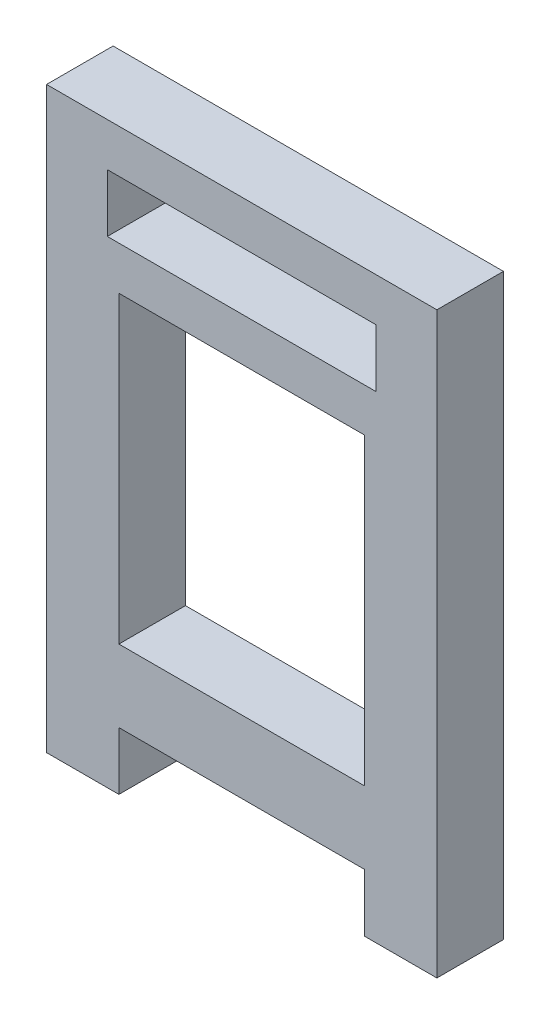
ISO-10303-21;
HEADER;
FILE_DESCRIPTION(('STEP AP214'),'2;1');
FILE_NAME('part.step','',(''),(''),'','','');
FILE_SCHEMA(('AUTOMOTIVE_DESIGN { 1 0 10303 214 1 1 1 1 }'));
ENDSEC;
DATA;
#1=APPLICATION_CONTEXT('core data for automotive mechanical design processes');
#2=APPLICATION_PROTOCOL_DEFINITION('international standard','automotive_design',2000,#1);
#3=PRODUCT_CONTEXT('',#1,'mechanical');
#4=PRODUCT('Part','Part','',(#3));
#5=PRODUCT_RELATED_PRODUCT_CATEGORY('part','',(#4));
#6=PRODUCT_DEFINITION_FORMATION('','',#4);
#7=PRODUCT_DEFINITION_CONTEXT('part definition',#1,'design');
#8=PRODUCT_DEFINITION('design','',#6,#7);
#9=PRODUCT_DEFINITION_SHAPE('','',#8);
#10=(LENGTH_UNIT() NAMED_UNIT(*) SI_UNIT(.MILLI.,.METRE.));
#11=(NAMED_UNIT(*) PLANE_ANGLE_UNIT() SI_UNIT($,.RADIAN.));
#12=(NAMED_UNIT(*) SI_UNIT($,.STERADIAN.) SOLID_ANGLE_UNIT());
#13=UNCERTAINTY_MEASURE_WITH_UNIT(LENGTH_MEASURE(1.E-05),#10,'distance_accuracy_value','');
#14=(GEOMETRIC_REPRESENTATION_CONTEXT(3) GLOBAL_UNCERTAINTY_ASSIGNED_CONTEXT((#13)) GLOBAL_UNIT_ASSIGNED_CONTEXT((#10,
#11,#12)) REPRESENTATION_CONTEXT('',''));
#15=CARTESIAN_POINT('',(0.,0.,0.));
#16=DIRECTION('',(0.,0.,1.));
#17=DIRECTION('',(1.,0.,0.));
#18=AXIS2_PLACEMENT_3D('',#15,#16,#17);
#19=CARTESIAN_POINT('',(0.,0.,2.3));
#20=DIRECTION('',(0.,0.,-1.));
#21=DIRECTION('',(-1.,0.,0.));
#22=AXIS2_PLACEMENT_3D('',#19,#20,#21);
#23=PLANE('',#22);
#24=DIRECTION('',(0.,1.,0.));
#25=VECTOR('',#24,1.);
#26=CARTESIAN_POINT('',(10.99,2.5,2.3));
#27=LINE('',#26,#25);
#28=CARTESIAN_POINT('',(10.99,2.5,2.3));
#29=VERTEX_POINT('',#28);
#30=CARTESIAN_POINT('',(10.99,13.,2.3));
#31=VERTEX_POINT('',#30);
#32=EDGE_CURVE('E188',#29,#31,#27,.T.);
#33=ORIENTED_EDGE('',*,*,#32,.F.);
#34=DIRECTION('',(1.,0.,0.));
#35=VECTOR('',#34,1.);
#36=CARTESIAN_POINT('',(2.5,2.5,2.3));
#37=LINE('',#36,#35);
#38=CARTESIAN_POINT('',(2.5,2.5,2.3));
#39=VERTEX_POINT('',#38);
#40=EDGE_CURVE('E196',#39,#29,#37,.T.);
#41=ORIENTED_EDGE('',*,*,#40,.F.);
#42=DIRECTION('',(0.,-1.,0.));
#43=VECTOR('',#42,1.);
#44=CARTESIAN_POINT('',(2.5,2.5,2.3));
#45=LINE('',#44,#43);
#46=CARTESIAN_POINT('',(2.5,13.,2.3));
#47=VERTEX_POINT('',#46);
#48=EDGE_CURVE('E193',#47,#39,#45,.T.);
#49=ORIENTED_EDGE('',*,*,#48,.F.);
#50=DIRECTION('',(-1.,0.,0.));
#51=VECTOR('',#50,1.);
#52=CARTESIAN_POINT('',(2.5,13.,2.3));
#53=LINE('',#52,#51);
#54=EDGE_CURVE('E190',#31,#47,#53,.T.);
#55=ORIENTED_EDGE('',*,*,#54,.F.);
#56=EDGE_LOOP('',(#33,#41,#49,#55));
#57=FACE_BOUND('',#56,.T.);
#58=DIRECTION('',(0.,-1.,0.));
#59=VECTOR('',#58,1.);
#60=CARTESIAN_POINT('',(0.,0.,2.3));
#61=LINE('',#60,#59);
#62=CARTESIAN_POINT('',(0.,18.,2.3));
#63=VERTEX_POINT('',#62);
#64=CARTESIAN_POINT('',(0.,-2.,2.3));
#65=VERTEX_POINT('',#64);
#66=EDGE_CURVE('E219',#63,#65,#61,.T.);
#67=ORIENTED_EDGE('',*,*,#66,.T.);
#68=DIRECTION('',(1.,0.,0.));
#69=VECTOR('',#68,1.);
#70=CARTESIAN_POINT('',(0.,-2.,2.3));
#71=LINE('',#70,#69);
#72=CARTESIAN_POINT('',(2.5,-2.,2.3));
#73=VERTEX_POINT('',#72);
#74=EDGE_CURVE('E221',#65,#73,#71,.T.);
#75=ORIENTED_EDGE('',*,*,#74,.T.);
#76=DIRECTION('',(0.,1.,0.));
#77=VECTOR('',#76,1.);
#78=CARTESIAN_POINT('',(2.5,-2.,2.3));
#79=LINE('',#78,#77);
#80=CARTESIAN_POINT('',(2.5,0.,2.3));
#81=VERTEX_POINT('',#80);
#82=EDGE_CURVE('E224',#73,#81,#79,.T.);
#83=ORIENTED_EDGE('',*,*,#82,.T.);
#84=DIRECTION('',(1.,0.,0.));
#85=VECTOR('',#84,1.);
#86=CARTESIAN_POINT('',(2.5,0.,2.3));
#87=LINE('',#86,#85);
#88=CARTESIAN_POINT('',(10.99,0.,2.3));
#89=VERTEX_POINT('',#88);
#90=EDGE_CURVE('E226',#81,#89,#87,.T.);
#91=ORIENTED_EDGE('',*,*,#90,.T.);
#92=DIRECTION('',(0.,-1.,0.));
#93=VECTOR('',#92,1.);
#94=CARTESIAN_POINT('',(10.99,-2.,2.3));
#95=LINE('',#94,#93);
#96=CARTESIAN_POINT('',(10.99,-2.,2.3));
#97=VERTEX_POINT('',#96);
#98=EDGE_CURVE('E228',#89,#97,#95,.T.);
#99=ORIENTED_EDGE('',*,*,#98,.T.);
#100=DIRECTION('',(1.,0.,0.));
#101=VECTOR('',#100,1.);
#102=CARTESIAN_POINT('',(13.49,-2.,2.3));
#103=LINE('',#102,#101);
#104=CARTESIAN_POINT('',(13.49,-2.,2.3));
#105=VERTEX_POINT('',#104);
#106=EDGE_CURVE('E230',#97,#105,#103,.T.);
#107=ORIENTED_EDGE('',*,*,#106,.T.);
#108=DIRECTION('',(0.,1.,0.));
#109=VECTOR('',#108,1.);
#110=CARTESIAN_POINT('',(13.49,0.,2.3));
#111=LINE('',#110,#109);
#112=CARTESIAN_POINT('',(13.49,18.,2.3));
#113=VERTEX_POINT('',#112);
#114=EDGE_CURVE('E232',#105,#113,#111,.T.);
#115=ORIENTED_EDGE('',*,*,#114,.T.);
#116=DIRECTION('',(-1.,0.,0.));
#117=VECTOR('',#116,1.);
#118=CARTESIAN_POINT('',(0.,18.,2.3));
#119=LINE('',#118,#117);
#120=EDGE_CURVE('E234',#113,#63,#119,.T.);
#121=ORIENTED_EDGE('',*,*,#120,.T.);
#122=EDGE_LOOP('',(#67,#75,#83,#91,#99,#107,#115,#121));
#123=FACE_BOUND('',#122,.T.);
#124=DIRECTION('',(0.,-1.,0.));
#125=VECTOR('',#124,1.);
#126=CARTESIAN_POINT('',(2.1,14.5,2.3));
#127=LINE('',#126,#125);
#128=CARTESIAN_POINT('',(2.1,16.5,2.3));
#129=VERTEX_POINT('',#128);
#130=CARTESIAN_POINT('',(2.1,14.5,2.3));
#131=VERTEX_POINT('',#130);
#132=EDGE_CURVE('E152',#129,#131,#127,.T.);
#133=ORIENTED_EDGE('',*,*,#132,.F.);
#134=DIRECTION('',(-1.,0.,0.));
#135=VECTOR('',#134,1.);
#136=CARTESIAN_POINT('',(2.1,16.5,2.3));
#137=LINE('',#136,#135);
#138=CARTESIAN_POINT('',(11.39,16.5,2.3));
#139=VERTEX_POINT('',#138);
#140=EDGE_CURVE('E174',#139,#129,#137,.T.);
#141=ORIENTED_EDGE('',*,*,#140,.F.);
#142=DIRECTION('',(0.,1.,0.));
#143=VECTOR('',#142,1.);
#144=CARTESIAN_POINT('',(11.39,14.5,2.3));
#145=LINE('',#144,#143);
#146=CARTESIAN_POINT('',(11.39,14.5,2.3));
#147=VERTEX_POINT('',#146);
#148=EDGE_CURVE('E172',#147,#139,#145,.T.);
#149=ORIENTED_EDGE('',*,*,#148,.F.);
#150=DIRECTION('',(1.,0.,0.));
#151=VECTOR('',#150,1.);
#152=CARTESIAN_POINT('',(2.1,14.5,2.3));
#153=LINE('',#152,#151);
#154=EDGE_CURVE('E160',#131,#147,#153,.T.);
#155=ORIENTED_EDGE('',*,*,#154,.F.);
#156=EDGE_LOOP('',(#133,#141,#149,#155));
#157=FACE_BOUND('',#156,.T.);
#158=ADVANCED_FACE('F39',(#57,#123,#157),#23,.F.);
#159=CARTESIAN_POINT('',(0.,0.,0.));
#160=DIRECTION('',(0.,0.,-1.));
#161=DIRECTION('',(-1.,0.,0.));
#162=AXIS2_PLACEMENT_3D('',#159,#160,#161);
#163=PLANE('',#162);
#164=DIRECTION('',(0.,-1.,0.));
#165=VECTOR('',#164,1.);
#166=CARTESIAN_POINT('',(0.,0.,0.));
#167=LINE('',#166,#165);
#168=CARTESIAN_POINT('',(0.,18.,0.));
#169=VERTEX_POINT('',#168);
#170=CARTESIAN_POINT('',(0.,-2.,0.));
#171=VERTEX_POINT('',#170);
#172=EDGE_CURVE('E218',#169,#171,#167,.T.);
#173=ORIENTED_EDGE('',*,*,#172,.F.);
#174=DIRECTION('',(-1.,0.,0.));
#175=VECTOR('',#174,1.);
#176=CARTESIAN_POINT('',(0.,18.,0.));
#177=LINE('',#176,#175);
#178=CARTESIAN_POINT('',(13.49,18.,0.));
#179=VERTEX_POINT('',#178);
#180=EDGE_CURVE('E222',#179,#169,#177,.T.);
#181=ORIENTED_EDGE('',*,*,#180,.F.);
#182=DIRECTION('',(0.,1.,0.));
#183=VECTOR('',#182,1.);
#184=CARTESIAN_POINT('',(13.49,0.,0.));
#185=LINE('',#184,#183);
#186=CARTESIAN_POINT('',(13.49,-2.,0.));
#187=VERTEX_POINT('',#186);
#188=EDGE_CURVE('E249',#187,#179,#185,.T.);
#189=ORIENTED_EDGE('',*,*,#188,.F.);
#190=DIRECTION('',(1.,0.,0.));
#191=VECTOR('',#190,1.);
#192=CARTESIAN_POINT('',(13.49,-2.,0.));
#193=LINE('',#192,#191);
#194=CARTESIAN_POINT('',(10.99,-2.,0.));
#195=VERTEX_POINT('',#194);
#196=EDGE_CURVE('E246',#195,#187,#193,.T.);
#197=ORIENTED_EDGE('',*,*,#196,.F.);
#198=DIRECTION('',(0.,-1.,0.));
#199=VECTOR('',#198,1.);
#200=CARTESIAN_POINT('',(10.99,-2.,0.));
#201=LINE('',#200,#199);
#202=CARTESIAN_POINT('',(10.99,0.,0.));
#203=VERTEX_POINT('',#202);
#204=EDGE_CURVE('E244',#203,#195,#201,.T.);
#205=ORIENTED_EDGE('',*,*,#204,.F.);
#206=DIRECTION('',(1.,0.,0.));
#207=VECTOR('',#206,1.);
#208=CARTESIAN_POINT('',(2.5,0.,0.));
#209=LINE('',#208,#207);
#210=CARTESIAN_POINT('',(2.5,0.,0.));
#211=VERTEX_POINT('',#210);
#212=EDGE_CURVE('E242',#211,#203,#209,.T.);
#213=ORIENTED_EDGE('',*,*,#212,.F.);
#214=DIRECTION('',(0.,1.,0.));
#215=VECTOR('',#214,1.);
#216=CARTESIAN_POINT('',(2.5,-2.,0.));
#217=LINE('',#216,#215);
#218=CARTESIAN_POINT('',(2.5,-2.,0.));
#219=VERTEX_POINT('',#218);
#220=EDGE_CURVE('E240',#219,#211,#217,.T.);
#221=ORIENTED_EDGE('',*,*,#220,.F.);
#222=DIRECTION('',(1.,0.,0.));
#223=VECTOR('',#222,1.);
#224=CARTESIAN_POINT('',(0.,-2.,0.));
#225=LINE('',#224,#223);
#226=EDGE_CURVE('E238',#171,#219,#225,.T.);
#227=ORIENTED_EDGE('',*,*,#226,.F.);
#228=EDGE_LOOP('',(#173,#181,#189,#197,#205,#213,#221,#227));
#229=FACE_BOUND('',#228,.T.);
#230=DIRECTION('',(1.,0.,0.));
#231=VECTOR('',#230,1.);
#232=CARTESIAN_POINT('',(2.5,2.5,0.));
#233=LINE('',#232,#231);
#234=CARTESIAN_POINT('',(2.5,2.5,0.));
#235=VERTEX_POINT('',#234);
#236=CARTESIAN_POINT('',(10.99,2.5,0.));
#237=VERTEX_POINT('',#236);
#238=EDGE_CURVE('E191',#235,#237,#233,.T.);
#239=ORIENTED_EDGE('',*,*,#238,.T.);
#240=DIRECTION('',(0.,1.,0.));
#241=VECTOR('',#240,1.);
#242=CARTESIAN_POINT('',(10.99,2.5,0.));
#243=LINE('',#242,#241);
#244=CARTESIAN_POINT('',(10.99,13.,0.));
#245=VERTEX_POINT('',#244);
#246=EDGE_CURVE('E168',#237,#245,#243,.T.);
#247=ORIENTED_EDGE('',*,*,#246,.T.);
#248=DIRECTION('',(-1.,0.,0.));
#249=VECTOR('',#248,1.);
#250=CARTESIAN_POINT('',(2.5,13.,0.));
#251=LINE('',#250,#249);
#252=CARTESIAN_POINT('',(2.5,13.,0.));
#253=VERTEX_POINT('',#252);
#254=EDGE_CURVE('E201',#245,#253,#251,.T.);
#255=ORIENTED_EDGE('',*,*,#254,.T.);
#256=DIRECTION('',(0.,-1.,0.));
#257=VECTOR('',#256,1.);
#258=CARTESIAN_POINT('',(2.5,2.5,0.));
#259=LINE('',#258,#257);
#260=EDGE_CURVE('E204',#253,#235,#259,.T.);
#261=ORIENTED_EDGE('',*,*,#260,.T.);
#262=EDGE_LOOP('',(#239,#247,#255,#261));
#263=FACE_BOUND('',#262,.T.);
#264=DIRECTION('',(-1.,0.,0.));
#265=VECTOR('',#264,1.);
#266=CARTESIAN_POINT('',(2.1,16.5,0.));
#267=LINE('',#266,#265);
#268=CARTESIAN_POINT('',(11.39,16.5,0.));
#269=VERTEX_POINT('',#268);
#270=CARTESIAN_POINT('',(2.1,16.5,0.));
#271=VERTEX_POINT('',#270);
#272=EDGE_CURVE('E161',#269,#271,#267,.T.);
#273=ORIENTED_EDGE('',*,*,#272,.T.);
#274=DIRECTION('',(0.,-1.,0.));
#275=VECTOR('',#274,1.);
#276=CARTESIAN_POINT('',(2.1,14.5,0.));
#277=LINE('',#276,#275);
#278=CARTESIAN_POINT('',(2.1,14.5,0.));
#279=VERTEX_POINT('',#278);
#280=EDGE_CURVE('E62',#271,#279,#277,.T.);
#281=ORIENTED_EDGE('',*,*,#280,.T.);
#282=DIRECTION('',(1.,0.,0.));
#283=VECTOR('',#282,1.);
#284=CARTESIAN_POINT('',(2.1,14.5,0.));
#285=LINE('',#284,#283);
#286=CARTESIAN_POINT('',(11.39,14.5,0.));
#287=VERTEX_POINT('',#286);
#288=EDGE_CURVE('E167',#279,#287,#285,.T.);
#289=ORIENTED_EDGE('',*,*,#288,.T.);
#290=DIRECTION('',(0.,1.,0.));
#291=VECTOR('',#290,1.);
#292=CARTESIAN_POINT('',(11.39,14.5,0.));
#293=LINE('',#292,#291);
#294=EDGE_CURVE('E180',#287,#269,#293,.T.);
#295=ORIENTED_EDGE('',*,*,#294,.T.);
#296=EDGE_LOOP('',(#273,#281,#289,#295));
#297=FACE_BOUND('',#296,.T.);
#298=ADVANCED_FACE('F281',(#229,#263,#297),#163,.T.);
#299=CARTESIAN_POINT('',(0.,0.,2.3));
#300=DIRECTION('',(1.,0.,0.));
#301=DIRECTION('',(0.,1.,0.));
#302=AXIS2_PLACEMENT_3D('',#299,#300,#301);
#303=PLANE('',#302);
#304=ORIENTED_EDGE('',*,*,#172,.T.);
#305=DIRECTION('',(0.,0.,-1.));
#306=VECTOR('',#305,1.);
#307=CARTESIAN_POINT('',(0.,-2.,2.3));
#308=LINE('',#307,#306);
#309=EDGE_CURVE('E11',#65,#171,#308,.T.);
#310=ORIENTED_EDGE('',*,*,#309,.F.);
#311=ORIENTED_EDGE('',*,*,#66,.F.);
#312=DIRECTION('',(0.,0.,-1.));
#313=VECTOR('',#312,1.);
#314=CARTESIAN_POINT('',(0.,18.,2.3));
#315=LINE('',#314,#313);
#316=EDGE_CURVE('E236',#63,#169,#315,.T.);
#317=ORIENTED_EDGE('',*,*,#316,.T.);
#318=EDGE_LOOP('',(#304,#310,#311,#317));
#319=FACE_BOUND('',#318,.T.);
#320=ADVANCED_FACE('F41',(#319),#303,.F.);
#321=CARTESIAN_POINT('',(0.,-2.,2.3));
#322=DIRECTION('',(0.,1.,0.));
#323=DIRECTION('',(0.,0.,1.));
#324=AXIS2_PLACEMENT_3D('',#321,#322,#323);
#325=PLANE('',#324);
#326=ORIENTED_EDGE('',*,*,#226,.T.);
#327=DIRECTION('',(0.,0.,-1.));
#328=VECTOR('',#327,1.);
#329=CARTESIAN_POINT('',(2.5,-2.,2.3));
#330=LINE('',#329,#328);
#331=EDGE_CURVE('E47',#73,#219,#330,.T.);
#332=ORIENTED_EDGE('',*,*,#331,.F.);
#333=ORIENTED_EDGE('',*,*,#74,.F.);
#334=ORIENTED_EDGE('',*,*,#309,.T.);
#335=EDGE_LOOP('',(#326,#332,#333,#334));
#336=FACE_BOUND('',#335,.T.);
#337=ADVANCED_FACE('F298',(#336),#325,.F.);
#338=CARTESIAN_POINT('',(2.5,-2.,2.3));
#339=DIRECTION('',(-1.,0.,0.));
#340=DIRECTION('',(0.,0.,1.));
#341=AXIS2_PLACEMENT_3D('',#338,#339,#340);
#342=PLANE('',#341);
#343=ORIENTED_EDGE('',*,*,#220,.T.);
#344=DIRECTION('',(0.,0.,-1.));
#345=VECTOR('',#344,1.);
#346=CARTESIAN_POINT('',(2.5,0.,2.3));
#347=LINE('',#346,#345);
#348=EDGE_CURVE('E267',#81,#211,#347,.T.);
#349=ORIENTED_EDGE('',*,*,#348,.F.);
#350=ORIENTED_EDGE('',*,*,#82,.F.);
#351=ORIENTED_EDGE('',*,*,#331,.T.);
#352=EDGE_LOOP('',(#343,#349,#350,#351));
#353=FACE_BOUND('',#352,.T.);
#354=ADVANCED_FACE('F274',(#353),#342,.F.);
#355=CARTESIAN_POINT('',(2.5,0.,2.3));
#356=DIRECTION('',(0.,1.,0.));
#357=DIRECTION('',(0.,0.,1.));
#358=AXIS2_PLACEMENT_3D('',#355,#356,#357);
#359=PLANE('',#358);
#360=ORIENTED_EDGE('',*,*,#212,.T.);
#361=DIRECTION('',(0.,0.,-1.));
#362=VECTOR('',#361,1.);
#363=CARTESIAN_POINT('',(10.99,0.,2.3));
#364=LINE('',#363,#362);
#365=EDGE_CURVE('E264',#89,#203,#364,.T.);
#366=ORIENTED_EDGE('',*,*,#365,.F.);
#367=ORIENTED_EDGE('',*,*,#90,.F.);
#368=ORIENTED_EDGE('',*,*,#348,.T.);
#369=EDGE_LOOP('',(#360,#366,#367,#368));
#370=FACE_BOUND('',#369,.T.);
#371=ADVANCED_FACE('F287',(#370),#359,.F.);
#372=CARTESIAN_POINT('',(10.99,-2.,2.3));
#373=DIRECTION('',(1.,0.,0.));
#374=DIRECTION('',(0.,0.,-1.));
#375=AXIS2_PLACEMENT_3D('',#372,#373,#374);
#376=PLANE('',#375);
#377=ORIENTED_EDGE('',*,*,#204,.T.);
#378=DIRECTION('',(0.,0.,-1.));
#379=VECTOR('',#378,1.);
#380=CARTESIAN_POINT('',(10.99,-2.,2.3));
#381=LINE('',#380,#379);
#382=EDGE_CURVE('E261',#97,#195,#381,.T.);
#383=ORIENTED_EDGE('',*,*,#382,.F.);
#384=ORIENTED_EDGE('',*,*,#98,.F.);
#385=ORIENTED_EDGE('',*,*,#365,.T.);
#386=EDGE_LOOP('',(#377,#383,#384,#385));
#387=FACE_BOUND('',#386,.T.);
#388=ADVANCED_FACE('F291',(#387),#376,.F.);
#389=CARTESIAN_POINT('',(13.49,-2.,2.3));
#390=DIRECTION('',(0.,1.,0.));
#391=DIRECTION('',(-1.,0.,0.));
#392=AXIS2_PLACEMENT_3D('',#389,#390,#391);
#393=PLANE('',#392);
#394=ORIENTED_EDGE('',*,*,#196,.T.);
#395=DIRECTION('',(0.,0.,-1.));
#396=VECTOR('',#395,1.);
#397=CARTESIAN_POINT('',(13.49,-2.,2.3));
#398=LINE('',#397,#396);
#399=EDGE_CURVE('E258',#105,#187,#398,.T.);
#400=ORIENTED_EDGE('',*,*,#399,.F.);
#401=ORIENTED_EDGE('',*,*,#106,.F.);
#402=ORIENTED_EDGE('',*,*,#382,.T.);
#403=EDGE_LOOP('',(#394,#400,#401,#402));
#404=FACE_BOUND('',#403,.T.);
#405=ADVANCED_FACE('F310',(#404),#393,.F.);
#406=CARTESIAN_POINT('',(13.49,0.,2.3));
#407=DIRECTION('',(-1.,0.,0.));
#408=DIRECTION('',(0.,0.,1.));
#409=AXIS2_PLACEMENT_3D('',#406,#407,#408);
#410=PLANE('',#409);
#411=ORIENTED_EDGE('',*,*,#188,.T.);
#412=DIRECTION('',(0.,0.,-1.));
#413=VECTOR('',#412,1.);
#414=CARTESIAN_POINT('',(13.49,18.,2.3));
#415=LINE('',#414,#413);
#416=EDGE_CURVE('E255',#113,#179,#415,.T.);
#417=ORIENTED_EDGE('',*,*,#416,.F.);
#418=ORIENTED_EDGE('',*,*,#114,.F.);
#419=ORIENTED_EDGE('',*,*,#399,.T.);
#420=EDGE_LOOP('',(#411,#417,#418,#419));
#421=FACE_BOUND('',#420,.T.);
#422=ADVANCED_FACE('F308',(#421),#410,.F.);
#423=CARTESIAN_POINT('',(0.,18.,2.3));
#424=DIRECTION('',(0.,-1.,0.));
#425=DIRECTION('',(0.,0.,-1.));
#426=AXIS2_PLACEMENT_3D('',#423,#424,#425);
#427=PLANE('',#426);
#428=ORIENTED_EDGE('',*,*,#180,.T.);
#429=ORIENTED_EDGE('',*,*,#316,.F.);
#430=ORIENTED_EDGE('',*,*,#120,.F.);
#431=ORIENTED_EDGE('',*,*,#416,.T.);
#432=EDGE_LOOP('',(#428,#429,#430,#431));
#433=FACE_BOUND('',#432,.T.);
#434=ADVANCED_FACE('F303',(#433),#427,.F.);
#435=CARTESIAN_POINT('',(10.99,2.5,2.3));
#436=DIRECTION('',(-1.,0.,0.));
#437=DIRECTION('',(0.,0.,1.));
#438=AXIS2_PLACEMENT_3D('',#435,#436,#437);
#439=PLANE('',#438);
#440=ORIENTED_EDGE('',*,*,#246,.F.);
#441=DIRECTION('',(0.,0.,-1.));
#442=VECTOR('',#441,1.);
#443=CARTESIAN_POINT('',(10.99,2.5,2.3));
#444=LINE('',#443,#442);
#445=EDGE_CURVE('E198',#29,#237,#444,.T.);
#446=ORIENTED_EDGE('',*,*,#445,.F.);
#447=ORIENTED_EDGE('',*,*,#32,.T.);
#448=DIRECTION('',(0.,0.,-1.));
#449=VECTOR('',#448,1.);
#450=CARTESIAN_POINT('',(10.99,13.,2.3));
#451=LINE('',#450,#449);
#452=EDGE_CURVE('E215',#31,#245,#451,.T.);
#453=ORIENTED_EDGE('',*,*,#452,.T.);
#454=EDGE_LOOP('',(#440,#446,#447,#453));
#455=FACE_BOUND('',#454,.T.);
#456=ADVANCED_FACE('F328',(#455),#439,.T.);
#457=CARTESIAN_POINT('',(2.5,13.,2.3));
#458=DIRECTION('',(0.,-1.,0.));
#459=DIRECTION('',(0.,0.,-1.));
#460=AXIS2_PLACEMENT_3D('',#457,#458,#459);
#461=PLANE('',#460);
#462=ORIENTED_EDGE('',*,*,#254,.F.);
#463=ORIENTED_EDGE('',*,*,#452,.F.);
#464=ORIENTED_EDGE('',*,*,#54,.T.);
#465=DIRECTION('',(0.,0.,-1.));
#466=VECTOR('',#465,1.);
#467=CARTESIAN_POINT('',(2.5,13.,2.3));
#468=LINE('',#467,#466);
#469=EDGE_CURVE('E213',#47,#253,#468,.T.);
#470=ORIENTED_EDGE('',*,*,#469,.T.);
#471=EDGE_LOOP('',(#462,#463,#464,#470));
#472=FACE_BOUND('',#471,.T.);
#473=ADVANCED_FACE('F335',(#472),#461,.T.);
#474=CARTESIAN_POINT('',(2.5,2.5,2.3));
#475=DIRECTION('',(1.,0.,0.));
#476=DIRECTION('',(0.,0.,-1.));
#477=AXIS2_PLACEMENT_3D('',#474,#475,#476);
#478=PLANE('',#477);
#479=ORIENTED_EDGE('',*,*,#260,.F.);
#480=ORIENTED_EDGE('',*,*,#469,.F.);
#481=ORIENTED_EDGE('',*,*,#48,.T.);
#482=DIRECTION('',(0.,0.,-1.));
#483=VECTOR('',#482,1.);
#484=CARTESIAN_POINT('',(2.5,2.5,2.3));
#485=LINE('',#484,#483);
#486=EDGE_CURVE('E211',#39,#235,#485,.T.);
#487=ORIENTED_EDGE('',*,*,#486,.T.);
#488=EDGE_LOOP('',(#479,#480,#481,#487));
#489=FACE_BOUND('',#488,.T.);
#490=ADVANCED_FACE('F340',(#489),#478,.T.);
#491=CARTESIAN_POINT('',(2.5,2.5,2.3));
#492=DIRECTION('',(0.,1.,0.));
#493=DIRECTION('',(0.,0.,1.));
#494=AXIS2_PLACEMENT_3D('',#491,#492,#493);
#495=PLANE('',#494);
#496=ORIENTED_EDGE('',*,*,#238,.F.);
#497=ORIENTED_EDGE('',*,*,#486,.F.);
#498=ORIENTED_EDGE('',*,*,#40,.T.);
#499=ORIENTED_EDGE('',*,*,#445,.T.);
#500=EDGE_LOOP('',(#496,#497,#498,#499));
#501=FACE_BOUND('',#500,.T.);
#502=ADVANCED_FACE('F346',(#501),#495,.T.);
#503=CARTESIAN_POINT('',(2.1,14.5,2.3));
#504=DIRECTION('',(1.,0.,0.));
#505=DIRECTION('',(0.,0.,-1.));
#506=AXIS2_PLACEMENT_3D('',#503,#504,#505);
#507=PLANE('',#506);
#508=ORIENTED_EDGE('',*,*,#280,.F.);
#509=DIRECTION('',(0.,0.,-1.));
#510=VECTOR('',#509,1.);
#511=CARTESIAN_POINT('',(2.1,16.5,2.3));
#512=LINE('',#511,#510);
#513=EDGE_CURVE('E156',#129,#271,#512,.T.);
#514=ORIENTED_EDGE('',*,*,#513,.F.);
#515=ORIENTED_EDGE('',*,*,#132,.T.);
#516=DIRECTION('',(0.,0.,-1.));
#517=VECTOR('',#516,1.);
#518=CARTESIAN_POINT('',(2.1,14.5,2.3));
#519=LINE('',#518,#517);
#520=EDGE_CURVE('E155',#131,#279,#519,.T.);
#521=ORIENTED_EDGE('',*,*,#520,.T.);
#522=EDGE_LOOP('',(#508,#514,#515,#521));
#523=FACE_BOUND('',#522,.T.);
#524=ADVANCED_FACE('F154',(#523),#507,.T.);
#525=CARTESIAN_POINT('',(2.1,14.5,2.3));
#526=DIRECTION('',(0.,1.,0.));
#527=DIRECTION('',(0.,0.,1.));
#528=AXIS2_PLACEMENT_3D('',#525,#526,#527);
#529=PLANE('',#528);
#530=ORIENTED_EDGE('',*,*,#288,.F.);
#531=ORIENTED_EDGE('',*,*,#520,.F.);
#532=ORIENTED_EDGE('',*,*,#154,.T.);
#533=DIRECTION('',(0.,0.,-1.));
#534=VECTOR('',#533,1.);
#535=CARTESIAN_POINT('',(11.39,14.5,2.3));
#536=LINE('',#535,#534);
#537=EDGE_CURVE('E169',#147,#287,#536,.T.);
#538=ORIENTED_EDGE('',*,*,#537,.T.);
#539=EDGE_LOOP('',(#530,#531,#532,#538));
#540=FACE_BOUND('',#539,.T.);
#541=ADVANCED_FACE('F164',(#540),#529,.T.);
#542=CARTESIAN_POINT('',(11.39,14.5,2.3));
#543=DIRECTION('',(-1.,0.,0.));
#544=DIRECTION('',(0.,0.,1.));
#545=AXIS2_PLACEMENT_3D('',#542,#543,#544);
#546=PLANE('',#545);
#547=ORIENTED_EDGE('',*,*,#294,.F.);
#548=ORIENTED_EDGE('',*,*,#537,.F.);
#549=ORIENTED_EDGE('',*,*,#148,.T.);
#550=DIRECTION('',(0.,0.,-1.));
#551=VECTOR('',#550,1.);
#552=CARTESIAN_POINT('',(11.39,16.5,2.3));
#553=LINE('',#552,#551);
#554=EDGE_CURVE('E54',#139,#269,#553,.T.);
#555=ORIENTED_EDGE('',*,*,#554,.T.);
#556=EDGE_LOOP('',(#547,#548,#549,#555));
#557=FACE_BOUND('',#556,.T.);
#558=ADVANCED_FACE('F365',(#557),#546,.T.);
#559=CARTESIAN_POINT('',(2.1,16.5,2.3));
#560=DIRECTION('',(0.,-1.,0.));
#561=DIRECTION('',(0.,0.,-1.));
#562=AXIS2_PLACEMENT_3D('',#559,#560,#561);
#563=PLANE('',#562);
#564=ORIENTED_EDGE('',*,*,#272,.F.);
#565=ORIENTED_EDGE('',*,*,#554,.F.);
#566=ORIENTED_EDGE('',*,*,#140,.T.);
#567=ORIENTED_EDGE('',*,*,#513,.T.);
#568=EDGE_LOOP('',(#564,#565,#566,#567));
#569=FACE_BOUND('',#568,.T.);
#570=ADVANCED_FACE('F368',(#569),#563,.T.);
#571=CLOSED_SHELL('',(#158,#298,#320,#337,#354,#371,#388,#405,#422,#434,#456,#473,#490,#502,
#524,#541,#558,#570));
#572=MANIFOLD_SOLID_BREP('B2',#571);
#573=ADVANCED_BREP_SHAPE_REPRESENTATION('',(#18,#572),#14);
#574=SHAPE_DEFINITION_REPRESENTATION(#9,#573);
ENDSEC;
END-ISO-10303-21;
